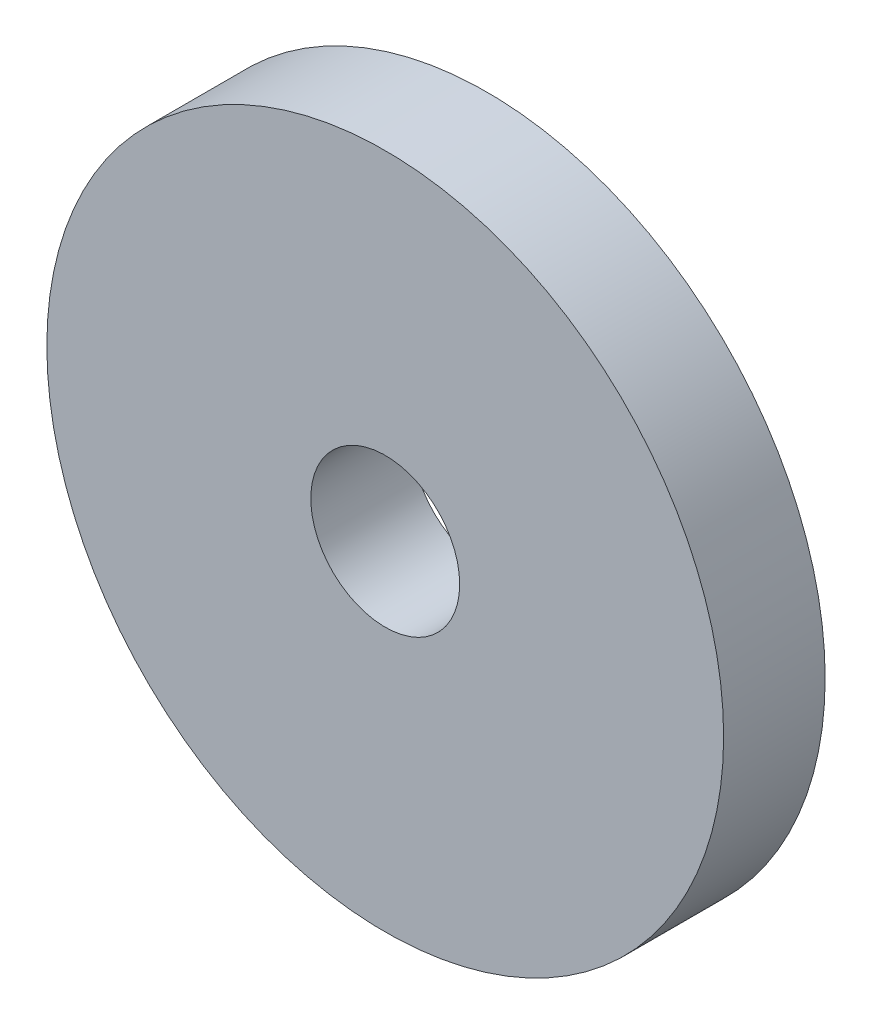
ISO-10303-21;
HEADER;
FILE_DESCRIPTION(('STEP AP214'),'2;1');
FILE_NAME('part.step','',(''),(''),'','','');
FILE_SCHEMA(('AUTOMOTIVE_DESIGN { 1 0 10303 214 1 1 1 1 }'));
ENDSEC;
DATA;
#1=APPLICATION_CONTEXT('core data for automotive mechanical design processes');
#2=APPLICATION_PROTOCOL_DEFINITION('international standard','automotive_design',2000,#1);
#3=PRODUCT_CONTEXT('',#1,'mechanical');
#4=PRODUCT('Part','Part','',(#3));
#5=PRODUCT_RELATED_PRODUCT_CATEGORY('part','',(#4));
#6=PRODUCT_DEFINITION_FORMATION('','',#4);
#7=PRODUCT_DEFINITION_CONTEXT('part definition',#1,'design');
#8=PRODUCT_DEFINITION('design','',#6,#7);
#9=PRODUCT_DEFINITION_SHAPE('','',#8);
#10=(LENGTH_UNIT() NAMED_UNIT(*) SI_UNIT(.MILLI.,.METRE.));
#11=(NAMED_UNIT(*) PLANE_ANGLE_UNIT() SI_UNIT($,.RADIAN.));
#12=(NAMED_UNIT(*) SI_UNIT($,.STERADIAN.) SOLID_ANGLE_UNIT());
#13=UNCERTAINTY_MEASURE_WITH_UNIT(LENGTH_MEASURE(1.E-05),#10,'distance_accuracy_value','');
#14=(GEOMETRIC_REPRESENTATION_CONTEXT(3) GLOBAL_UNCERTAINTY_ASSIGNED_CONTEXT((#13)) GLOBAL_UNIT_ASSIGNED_CONTEXT((#10,
#11,#12)) REPRESENTATION_CONTEXT('',''));
#15=CARTESIAN_POINT('',(0.,0.,0.));
#16=DIRECTION('',(0.,0.,1.));
#17=DIRECTION('',(1.,0.,0.));
#18=AXIS2_PLACEMENT_3D('',#15,#16,#17);
#19=CARTESIAN_POINT('',(0.,0.,1.5));
#20=DIRECTION('',(0.,0.,1.));
#21=DIRECTION('',(1.,0.,0.));
#22=AXIS2_PLACEMENT_3D('',#19,#20,#21);
#23=PLANE('',#22);
#24=CARTESIAN_POINT('',(0.,0.,1.5));
#25=DIRECTION('',(0.,0.,1.));
#26=DIRECTION('',(1.,0.,0.));
#27=AXIS2_PLACEMENT_3D('',#24,#25,#26);
#28=CIRCLE('',#27,5.);
#29=CARTESIAN_POINT('',(5.,0.,1.5));
#30=VERTEX_POINT('',#29);
#31=EDGE_CURVE('E10',#30,#30,#28,.T.);
#32=ORIENTED_EDGE('',*,*,#31,.T.);
#33=EDGE_LOOP('',(#32));
#34=FACE_BOUND('',#33,.T.);
#35=CARTESIAN_POINT('',(0.,0.,1.5));
#36=DIRECTION('',(0.,0.,1.));
#37=DIRECTION('',(1.,0.,0.));
#38=AXIS2_PLACEMENT_3D('',#35,#36,#37);
#39=CIRCLE('',#38,1.1);
#40=CARTESIAN_POINT('',(1.1,0.,1.5));
#41=VERTEX_POINT('',#40);
#42=EDGE_CURVE('E51',#41,#41,#39,.T.);
#43=ORIENTED_EDGE('',*,*,#42,.F.);
#44=EDGE_LOOP('',(#43));
#45=FACE_BOUND('',#44,.T.);
#46=ADVANCED_FACE('F36',(#34,#45),#23,.T.);
#47=CARTESIAN_POINT('',(0.,0.,0.));
#48=DIRECTION('',(0.,0.,1.));
#49=DIRECTION('',(1.,0.,0.));
#50=AXIS2_PLACEMENT_3D('',#47,#48,#49);
#51=PLANE('',#50);
#52=CARTESIAN_POINT('',(0.,0.,0.));
#53=DIRECTION('',(0.,0.,1.));
#54=DIRECTION('',(1.,0.,0.));
#55=AXIS2_PLACEMENT_3D('',#52,#53,#54);
#56=CIRCLE('',#55,5.);
#57=CARTESIAN_POINT('',(5.,0.,0.));
#58=VERTEX_POINT('',#57);
#59=EDGE_CURVE('E40',#58,#58,#56,.T.);
#60=ORIENTED_EDGE('',*,*,#59,.F.);
#61=EDGE_LOOP('',(#60));
#62=FACE_BOUND('',#61,.T.);
#63=CARTESIAN_POINT('',(0.,0.,0.));
#64=DIRECTION('',(0.,0.,1.));
#65=DIRECTION('',(1.,0.,0.));
#66=AXIS2_PLACEMENT_3D('',#63,#64,#65);
#67=CIRCLE('',#66,1.1);
#68=CARTESIAN_POINT('',(1.1,0.,0.));
#69=VERTEX_POINT('',#68);
#70=EDGE_CURVE('E53',#69,#69,#67,.T.);
#71=ORIENTED_EDGE('',*,*,#70,.T.);
#72=EDGE_LOOP('',(#71));
#73=FACE_BOUND('',#72,.T.);
#74=ADVANCED_FACE('F63',(#62,#73),#51,.F.);
#75=CARTESIAN_POINT('',(0.,0.,1.5));
#76=DIRECTION('',(0.,0.,-1.));
#77=DIRECTION('',(-1.,0.,0.));
#78=AXIS2_PLACEMENT_3D('',#75,#76,#77);
#79=CYLINDRICAL_SURFACE('',#78,5.);
#80=ORIENTED_EDGE('',*,*,#31,.F.);
#81=EDGE_LOOP('',(#80));
#82=FACE_BOUND('',#81,.T.);
#83=ORIENTED_EDGE('',*,*,#59,.T.);
#84=EDGE_LOOP('',(#83));
#85=FACE_BOUND('',#84,.T.);
#86=ADVANCED_FACE('F38',(#82,#85),#79,.T.);
#87=CARTESIAN_POINT('',(0.,0.,1.5));
#88=DIRECTION('',(0.,0.,-1.));
#89=DIRECTION('',(-1.,0.,0.));
#90=AXIS2_PLACEMENT_3D('',#87,#88,#89);
#91=CYLINDRICAL_SURFACE('',#90,1.1);
#92=ORIENTED_EDGE('',*,*,#42,.T.);
#93=EDGE_LOOP('',(#92));
#94=FACE_BOUND('',#93,.T.);
#95=ORIENTED_EDGE('',*,*,#70,.F.);
#96=EDGE_LOOP('',(#95));
#97=FACE_BOUND('',#96,.T.);
#98=ADVANCED_FACE('F59',(#94,#97),#91,.F.);
#99=CLOSED_SHELL('',(#46,#74,#86,#98));
#100=MANIFOLD_SOLID_BREP('B2',#99);
#101=ADVANCED_BREP_SHAPE_REPRESENTATION('',(#18,#100),#14);
#102=SHAPE_DEFINITION_REPRESENTATION(#9,#101);
ENDSEC;
END-ISO-10303-21;
